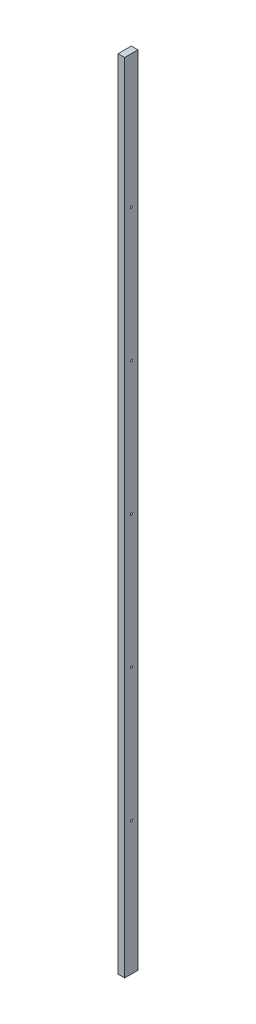
ISO-10303-21;
HEADER;
FILE_DESCRIPTION(('STEP AP214'),'2;1');
FILE_NAME('part.step','',(''),(''),'','','');
FILE_SCHEMA(('AUTOMOTIVE_DESIGN { 1 0 10303 214 1 1 1 1 }'));
ENDSEC;
DATA;
#1=APPLICATION_CONTEXT('core data for automotive mechanical design processes');
#2=APPLICATION_PROTOCOL_DEFINITION('international standard','automotive_design',2000,#1);
#3=PRODUCT_CONTEXT('',#1,'mechanical');
#4=PRODUCT('Part','Part','',(#3));
#5=PRODUCT_RELATED_PRODUCT_CATEGORY('part','',(#4));
#6=PRODUCT_DEFINITION_FORMATION('','',#4);
#7=PRODUCT_DEFINITION_CONTEXT('part definition',#1,'design');
#8=PRODUCT_DEFINITION('design','',#6,#7);
#9=PRODUCT_DEFINITION_SHAPE('','',#8);
#10=(LENGTH_UNIT() NAMED_UNIT(*) SI_UNIT(.MILLI.,.METRE.));
#11=(NAMED_UNIT(*) PLANE_ANGLE_UNIT() SI_UNIT($,.RADIAN.));
#12=(NAMED_UNIT(*) SI_UNIT($,.STERADIAN.) SOLID_ANGLE_UNIT());
#13=UNCERTAINTY_MEASURE_WITH_UNIT(LENGTH_MEASURE(1.E-05),#10,'distance_accuracy_value','');
#14=(GEOMETRIC_REPRESENTATION_CONTEXT(3) GLOBAL_UNCERTAINTY_ASSIGNED_CONTEXT((#13)) GLOBAL_UNIT_ASSIGNED_CONTEXT((#10,
#11,#12)) REPRESENTATION_CONTEXT('',''));
#15=CARTESIAN_POINT('',(0.,0.,0.));
#16=DIRECTION('',(0.,0.,1.));
#17=DIRECTION('',(1.,0.,0.));
#18=AXIS2_PLACEMENT_3D('',#15,#16,#17);
#19=CARTESIAN_POINT('',(-12.5,3000.,-25.));
#20=DIRECTION('',(1.,0.,0.));
#21=DIRECTION('',(0.,0.,-1.));
#22=AXIS2_PLACEMENT_3D('',#19,#20,#21);
#23=PLANE('',#22);
#24=CARTESIAN_POINT('',(-12.5000000000002,2500.,0.));
#25=DIRECTION('',(1.,0.,0.));
#26=DIRECTION('',(0.,0.,-1.));
#27=AXIS2_PLACEMENT_3D('',#24,#25,#26);
#28=CIRCLE('',#27,4.);
#29=CARTESIAN_POINT('',(-12.5000000000002,2500.,-4.));
#30=VERTEX_POINT('',#29);
#31=EDGE_CURVE('E115',#30,#30,#28,.T.);
#32=ORIENTED_EDGE('',*,*,#31,.T.);
#33=EDGE_LOOP('',(#32));
#34=FACE_BOUND('',#33,.T.);
#35=CARTESIAN_POINT('',(-12.5000000000002,2000.,0.));
#36=DIRECTION('',(1.,0.,0.));
#37=DIRECTION('',(0.,0.,-1.));
#38=AXIS2_PLACEMENT_3D('',#35,#36,#37);
#39=CIRCLE('',#38,4.);
#40=CARTESIAN_POINT('',(-12.5000000000002,2000.,-4.));
#41=VERTEX_POINT('',#40);
#42=EDGE_CURVE('E135',#41,#41,#39,.T.);
#43=ORIENTED_EDGE('',*,*,#42,.T.);
#44=EDGE_LOOP('',(#43));
#45=FACE_BOUND('',#44,.T.);
#46=CARTESIAN_POINT('',(-12.5000000000002,1500.,0.));
#47=DIRECTION('',(1.,0.,0.));
#48=DIRECTION('',(0.,0.,-1.));
#49=AXIS2_PLACEMENT_3D('',#46,#47,#48);
#50=CIRCLE('',#49,4.);
#51=CARTESIAN_POINT('',(-12.5000000000002,1500.,-4.));
#52=VERTEX_POINT('',#51);
#53=EDGE_CURVE('E139',#52,#52,#50,.T.);
#54=ORIENTED_EDGE('',*,*,#53,.T.);
#55=EDGE_LOOP('',(#54));
#56=FACE_BOUND('',#55,.T.);
#57=CARTESIAN_POINT('',(-12.5000000000002,1000.,0.));
#58=DIRECTION('',(1.,0.,0.));
#59=DIRECTION('',(0.,0.,-1.));
#60=AXIS2_PLACEMENT_3D('',#57,#58,#59);
#61=CIRCLE('',#60,4.);
#62=CARTESIAN_POINT('',(-12.5000000000002,1000.,-4.));
#63=VERTEX_POINT('',#62);
#64=EDGE_CURVE('E143',#63,#63,#61,.T.);
#65=ORIENTED_EDGE('',*,*,#64,.T.);
#66=EDGE_LOOP('',(#65));
#67=FACE_BOUND('',#66,.T.);
#68=CARTESIAN_POINT('',(-12.5000000000002,500.,0.));
#69=DIRECTION('',(1.,0.,0.));
#70=DIRECTION('',(0.,0.,-1.));
#71=AXIS2_PLACEMENT_3D('',#68,#69,#70);
#72=CIRCLE('',#71,4.);
#73=CARTESIAN_POINT('',(-12.5000000000002,500.,-4.));
#74=VERTEX_POINT('',#73);
#75=EDGE_CURVE('E147',#74,#74,#72,.T.);
#76=ORIENTED_EDGE('',*,*,#75,.T.);
#77=EDGE_LOOP('',(#76));
#78=FACE_BOUND('',#77,.T.);
#79=DIRECTION('',(0.,0.,1.));
#80=VECTOR('',#79,1.);
#81=CARTESIAN_POINT('',(-12.5,0.,-25.));
#82=LINE('',#81,#80);
#83=CARTESIAN_POINT('',(-12.5,0.,-25.));
#84=VERTEX_POINT('',#83);
#85=CARTESIAN_POINT('',(-12.5,0.,25.));
#86=VERTEX_POINT('',#85);
#87=EDGE_CURVE('E111',#84,#86,#82,.T.);
#88=ORIENTED_EDGE('',*,*,#87,.T.);
#89=DIRECTION('',(0.,-1.,0.));
#90=VECTOR('',#89,1.);
#91=CARTESIAN_POINT('',(-12.5,3000.,25.));
#92=LINE('',#91,#90);
#93=CARTESIAN_POINT('',(-12.5,3000.,25.));
#94=VERTEX_POINT('',#93);
#95=EDGE_CURVE('E11',#94,#86,#92,.T.);
#96=ORIENTED_EDGE('',*,*,#95,.F.);
#97=DIRECTION('',(0.,0.,1.));
#98=VECTOR('',#97,1.);
#99=CARTESIAN_POINT('',(-12.5,3000.,-25.));
#100=LINE('',#99,#98);
#101=CARTESIAN_POINT('',(-12.5,3000.,-25.));
#102=VERTEX_POINT('',#101);
#103=EDGE_CURVE('E95',#102,#94,#100,.T.);
#104=ORIENTED_EDGE('',*,*,#103,.F.);
#105=DIRECTION('',(0.,-1.,0.));
#106=VECTOR('',#105,1.);
#107=CARTESIAN_POINT('',(-12.5,3000.,-25.));
#108=LINE('',#107,#106);
#109=EDGE_CURVE('E107',#102,#84,#108,.T.);
#110=ORIENTED_EDGE('',*,*,#109,.T.);
#111=EDGE_LOOP('',(#88,#96,#104,#110));
#112=FACE_BOUND('',#111,.T.);
#113=ADVANCED_FACE('F43',(#34,#45,#56,#67,#78,#112),#23,.F.);
#114=CARTESIAN_POINT('',(12.5,3000.,25.));
#115=DIRECTION('',(0.,0.,-1.));
#116=DIRECTION('',(-1.,0.,0.));
#117=AXIS2_PLACEMENT_3D('',#114,#115,#116);
#118=PLANE('',#117);
#119=DIRECTION('',(1.,0.,0.));
#120=VECTOR('',#119,1.);
#121=CARTESIAN_POINT('',(12.5,0.,25.));
#122=LINE('',#121,#120);
#123=CARTESIAN_POINT('',(12.5,0.,25.));
#124=VERTEX_POINT('',#123);
#125=EDGE_CURVE('E100',#86,#124,#122,.T.);
#126=ORIENTED_EDGE('',*,*,#125,.T.);
#127=DIRECTION('',(0.,-1.,0.));
#128=VECTOR('',#127,1.);
#129=CARTESIAN_POINT('',(12.5,3000.,25.));
#130=LINE('',#129,#128);
#131=CARTESIAN_POINT('',(12.5,3000.,25.));
#132=VERTEX_POINT('',#131);
#133=EDGE_CURVE('E52',#132,#124,#130,.T.);
#134=ORIENTED_EDGE('',*,*,#133,.F.);
#135=DIRECTION('',(1.,0.,0.));
#136=VECTOR('',#135,1.);
#137=CARTESIAN_POINT('',(12.5,3000.,25.));
#138=LINE('',#137,#136);
#139=EDGE_CURVE('E90',#94,#132,#138,.T.);
#140=ORIENTED_EDGE('',*,*,#139,.F.);
#141=ORIENTED_EDGE('',*,*,#95,.T.);
#142=EDGE_LOOP('',(#126,#134,#140,#141));
#143=FACE_BOUND('',#142,.T.);
#144=ADVANCED_FACE('F99',(#143),#118,.F.);
#145=CARTESIAN_POINT('',(12.5,3000.,-25.));
#146=DIRECTION('',(-1.,0.,0.));
#147=DIRECTION('',(0.,0.,1.));
#148=AXIS2_PLACEMENT_3D('',#145,#146,#147);
#149=PLANE('',#148);
#150=CARTESIAN_POINT('',(12.5,2500.,0.));
#151=DIRECTION('',(1.,0.,0.));
#152=DIRECTION('',(0.,0.,-1.));
#153=AXIS2_PLACEMENT_3D('',#150,#151,#152);
#154=CIRCLE('',#153,4.);
#155=CARTESIAN_POINT('',(12.5,2500.,-4.));
#156=VERTEX_POINT('',#155);
#157=EDGE_CURVE('E151',#156,#156,#154,.T.);
#158=ORIENTED_EDGE('',*,*,#157,.F.);
#159=EDGE_LOOP('',(#158));
#160=FACE_BOUND('',#159,.T.);
#161=CARTESIAN_POINT('',(12.5,2000.,0.));
#162=DIRECTION('',(1.,0.,0.));
#163=DIRECTION('',(0.,0.,-1.));
#164=AXIS2_PLACEMENT_3D('',#161,#162,#163);
#165=CIRCLE('',#164,4.);
#166=CARTESIAN_POINT('',(12.5,2000.,-4.));
#167=VERTEX_POINT('',#166);
#168=EDGE_CURVE('E164',#167,#167,#165,.T.);
#169=ORIENTED_EDGE('',*,*,#168,.F.);
#170=EDGE_LOOP('',(#169));
#171=FACE_BOUND('',#170,.T.);
#172=CARTESIAN_POINT('',(12.5,1500.,0.));
#173=DIRECTION('',(1.,0.,0.));
#174=DIRECTION('',(0.,0.,-1.));
#175=AXIS2_PLACEMENT_3D('',#172,#173,#174);
#176=CIRCLE('',#175,4.);
#177=CARTESIAN_POINT('',(12.5,1500.,-4.));
#178=VERTEX_POINT('',#177);
#179=EDGE_CURVE('E160',#178,#178,#176,.T.);
#180=ORIENTED_EDGE('',*,*,#179,.F.);
#181=EDGE_LOOP('',(#180));
#182=FACE_BOUND('',#181,.T.);
#183=CARTESIAN_POINT('',(12.5,1000.,0.));
#184=DIRECTION('',(1.,0.,0.));
#185=DIRECTION('',(0.,0.,-1.));
#186=AXIS2_PLACEMENT_3D('',#183,#184,#185);
#187=CIRCLE('',#186,4.);
#188=CARTESIAN_POINT('',(12.5,1000.,-4.));
#189=VERTEX_POINT('',#188);
#190=EDGE_CURVE('E156',#189,#189,#187,.T.);
#191=ORIENTED_EDGE('',*,*,#190,.F.);
#192=EDGE_LOOP('',(#191));
#193=FACE_BOUND('',#192,.T.);
#194=CARTESIAN_POINT('',(12.5,500.,0.));
#195=DIRECTION('',(1.,0.,0.));
#196=DIRECTION('',(0.,0.,-1.));
#197=AXIS2_PLACEMENT_3D('',#194,#195,#196);
#198=CIRCLE('',#197,4.);
#199=CARTESIAN_POINT('',(12.5,500.,-4.));
#200=VERTEX_POINT('',#199);
#201=EDGE_CURVE('E152',#200,#200,#198,.T.);
#202=ORIENTED_EDGE('',*,*,#201,.F.);
#203=EDGE_LOOP('',(#202));
#204=FACE_BOUND('',#203,.T.);
#205=DIRECTION('',(0.,0.,-1.));
#206=VECTOR('',#205,1.);
#207=CARTESIAN_POINT('',(12.5,0.,-25.));
#208=LINE('',#207,#206);
#209=CARTESIAN_POINT('',(12.5,0.,-25.));
#210=VERTEX_POINT('',#209);
#211=EDGE_CURVE('E77',#124,#210,#208,.T.);
#212=ORIENTED_EDGE('',*,*,#211,.T.);
#213=DIRECTION('',(0.,-1.,0.));
#214=VECTOR('',#213,1.);
#215=CARTESIAN_POINT('',(12.5,3000.,-25.));
#216=LINE('',#215,#214);
#217=CARTESIAN_POINT('',(12.5,3000.,-25.));
#218=VERTEX_POINT('',#217);
#219=EDGE_CURVE('E102',#218,#210,#216,.T.);
#220=ORIENTED_EDGE('',*,*,#219,.F.);
#221=DIRECTION('',(0.,0.,-1.));
#222=VECTOR('',#221,1.);
#223=CARTESIAN_POINT('',(12.5,3000.,-25.));
#224=LINE('',#223,#222);
#225=EDGE_CURVE('E93',#132,#218,#224,.T.);
#226=ORIENTED_EDGE('',*,*,#225,.F.);
#227=ORIENTED_EDGE('',*,*,#133,.T.);
#228=EDGE_LOOP('',(#212,#220,#226,#227));
#229=FACE_BOUND('',#228,.T.);
#230=ADVANCED_FACE('F103',(#160,#171,#182,#193,#204,#229),#149,.F.);
#231=CARTESIAN_POINT('',(12.5,3000.,-25.));
#232=DIRECTION('',(0.,0.,1.));
#233=DIRECTION('',(1.,0.,0.));
#234=AXIS2_PLACEMENT_3D('',#231,#232,#233);
#235=PLANE('',#234);
#236=DIRECTION('',(-1.,0.,0.));
#237=VECTOR('',#236,1.);
#238=CARTESIAN_POINT('',(12.5,0.,-25.));
#239=LINE('',#238,#237);
#240=EDGE_CURVE('E83',#210,#84,#239,.T.);
#241=ORIENTED_EDGE('',*,*,#240,.T.);
#242=ORIENTED_EDGE('',*,*,#109,.F.);
#243=DIRECTION('',(-1.,0.,0.));
#244=VECTOR('',#243,1.);
#245=CARTESIAN_POINT('',(12.5,3000.,-25.));
#246=LINE('',#245,#244);
#247=EDGE_CURVE('E60',#218,#102,#246,.T.);
#248=ORIENTED_EDGE('',*,*,#247,.F.);
#249=ORIENTED_EDGE('',*,*,#219,.T.);
#250=EDGE_LOOP('',(#241,#242,#248,#249));
#251=FACE_BOUND('',#250,.T.);
#252=ADVANCED_FACE('F125',(#251),#235,.F.);
#253=CARTESIAN_POINT('',(0.,3000.,0.));
#254=DIRECTION('',(0.,-1.,0.));
#255=DIRECTION('',(0.,0.,-1.));
#256=AXIS2_PLACEMENT_3D('',#253,#254,#255);
#257=PLANE('',#256);
#258=ORIENTED_EDGE('',*,*,#103,.T.);
#259=ORIENTED_EDGE('',*,*,#139,.T.);
#260=ORIENTED_EDGE('',*,*,#225,.T.);
#261=ORIENTED_EDGE('',*,*,#247,.T.);
#262=EDGE_LOOP('',(#258,#259,#260,#261));
#263=FACE_BOUND('',#262,.T.);
#264=ADVANCED_FACE('F91',(#263),#257,.F.);
#265=CARTESIAN_POINT('',(0.,0.,0.));
#266=DIRECTION('',(0.,-1.,0.));
#267=DIRECTION('',(0.,0.,-1.));
#268=AXIS2_PLACEMENT_3D('',#265,#266,#267);
#269=PLANE('',#268);
#270=ORIENTED_EDGE('',*,*,#87,.F.);
#271=ORIENTED_EDGE('',*,*,#240,.F.);
#272=ORIENTED_EDGE('',*,*,#211,.F.);
#273=ORIENTED_EDGE('',*,*,#125,.F.);
#274=EDGE_LOOP('',(#270,#271,#272,#273));
#275=FACE_BOUND('',#274,.T.);
#276=ADVANCED_FACE('F128',(#275),#269,.T.);
#277=CARTESIAN_POINT('',(-2987.5,500.,0.));
#278=DIRECTION('',(1.,0.,0.));
#279=DIRECTION('',(0.,0.,-1.));
#280=AXIS2_PLACEMENT_3D('',#277,#278,#279);
#281=CYLINDRICAL_SURFACE('',#280,4.);
#282=ORIENTED_EDGE('',*,*,#201,.T.);
#283=EDGE_LOOP('',(#282));
#284=FACE_BOUND('',#283,.T.);
#285=ORIENTED_EDGE('',*,*,#75,.F.);
#286=EDGE_LOOP('',(#285));
#287=FACE_BOUND('',#286,.T.);
#288=ADVANCED_FACE('F186',(#284,#287),#281,.F.);
#289=CARTESIAN_POINT('',(-2987.5,1000.,0.));
#290=DIRECTION('',(1.,0.,0.));
#291=DIRECTION('',(0.,0.,-1.));
#292=AXIS2_PLACEMENT_3D('',#289,#290,#291);
#293=CYLINDRICAL_SURFACE('',#292,4.);
#294=ORIENTED_EDGE('',*,*,#190,.T.);
#295=EDGE_LOOP('',(#294));
#296=FACE_BOUND('',#295,.T.);
#297=ORIENTED_EDGE('',*,*,#64,.F.);
#298=EDGE_LOOP('',(#297));
#299=FACE_BOUND('',#298,.T.);
#300=ADVANCED_FACE('F189',(#296,#299),#293,.F.);
#301=CARTESIAN_POINT('',(-2987.5,1500.,0.));
#302=DIRECTION('',(1.,0.,0.));
#303=DIRECTION('',(0.,0.,-1.));
#304=AXIS2_PLACEMENT_3D('',#301,#302,#303);
#305=CYLINDRICAL_SURFACE('',#304,4.);
#306=ORIENTED_EDGE('',*,*,#179,.T.);
#307=EDGE_LOOP('',(#306));
#308=FACE_BOUND('',#307,.T.);
#309=ORIENTED_EDGE('',*,*,#53,.F.);
#310=EDGE_LOOP('',(#309));
#311=FACE_BOUND('',#310,.T.);
#312=ADVANCED_FACE('F207',(#308,#311),#305,.F.);
#313=CARTESIAN_POINT('',(-2987.5,2000.,0.));
#314=DIRECTION('',(1.,0.,0.));
#315=DIRECTION('',(0.,0.,-1.));
#316=AXIS2_PLACEMENT_3D('',#313,#314,#315);
#317=CYLINDRICAL_SURFACE('',#316,4.);
#318=ORIENTED_EDGE('',*,*,#168,.T.);
#319=EDGE_LOOP('',(#318));
#320=FACE_BOUND('',#319,.T.);
#321=ORIENTED_EDGE('',*,*,#42,.F.);
#322=EDGE_LOOP('',(#321));
#323=FACE_BOUND('',#322,.T.);
#324=ADVANCED_FACE('F213',(#320,#323),#317,.F.);
#325=CARTESIAN_POINT('',(-2987.5,2500.,0.));
#326=DIRECTION('',(1.,0.,0.));
#327=DIRECTION('',(0.,0.,-1.));
#328=AXIS2_PLACEMENT_3D('',#325,#326,#327);
#329=CYLINDRICAL_SURFACE('',#328,4.);
#330=ORIENTED_EDGE('',*,*,#157,.T.);
#331=EDGE_LOOP('',(#330));
#332=FACE_BOUND('',#331,.T.);
#333=ORIENTED_EDGE('',*,*,#31,.F.);
#334=EDGE_LOOP('',(#333));
#335=FACE_BOUND('',#334,.T.);
#336=ADVANCED_FACE('F172',(#332,#335),#329,.F.);
#337=CLOSED_SHELL('',(#113,#144,#230,#252,#264,#276,#288,#300,#312,#324,#336));
#338=MANIFOLD_SOLID_BREP('B2',#337);
#339=ADVANCED_BREP_SHAPE_REPRESENTATION('',(#18,#338),#14);
#340=SHAPE_DEFINITION_REPRESENTATION(#9,#339);
ENDSEC;
END-ISO-10303-21;
